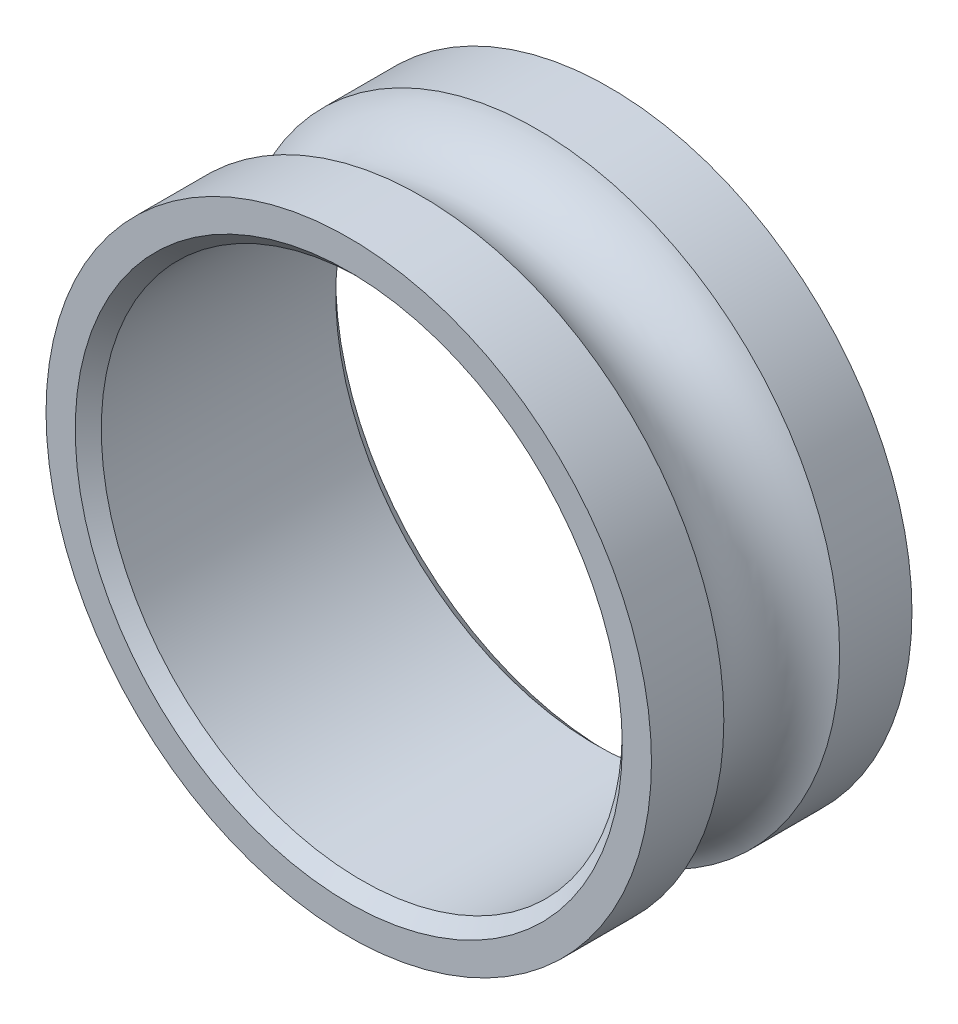
ISO-10303-21;
HEADER;
FILE_DESCRIPTION(('STEP AP214'),'2;1');
FILE_NAME('part.step','',(''),(''),'','','');
FILE_SCHEMA(('AUTOMOTIVE_DESIGN { 1 0 10303 214 1 1 1 1 }'));
ENDSEC;
DATA;
#1=APPLICATION_CONTEXT('core data for automotive mechanical design processes');
#2=APPLICATION_PROTOCOL_DEFINITION('international standard','automotive_design',2000,#1);
#3=PRODUCT_CONTEXT('',#1,'mechanical');
#4=PRODUCT('Part','Part','',(#3));
#5=PRODUCT_RELATED_PRODUCT_CATEGORY('part','',(#4));
#6=PRODUCT_DEFINITION_FORMATION('','',#4);
#7=PRODUCT_DEFINITION_CONTEXT('part definition',#1,'design');
#8=PRODUCT_DEFINITION('design','',#6,#7);
#9=PRODUCT_DEFINITION_SHAPE('','',#8);
#10=(LENGTH_UNIT() NAMED_UNIT(*) SI_UNIT(.MILLI.,.METRE.));
#11=(NAMED_UNIT(*) PLANE_ANGLE_UNIT() SI_UNIT($,.RADIAN.));
#12=(NAMED_UNIT(*) SI_UNIT($,.STERADIAN.) SOLID_ANGLE_UNIT());
#13=UNCERTAINTY_MEASURE_WITH_UNIT(LENGTH_MEASURE(1.E-05),#10,'distance_accuracy_value','');
#14=(GEOMETRIC_REPRESENTATION_CONTEXT(3) GLOBAL_UNCERTAINTY_ASSIGNED_CONTEXT((#13)) GLOBAL_UNIT_ASSIGNED_CONTEXT((#10,
#11,#12)) REPRESENTATION_CONTEXT('',''));
#15=CARTESIAN_POINT('',(0.,0.,0.));
#16=DIRECTION('',(0.,0.,1.));
#17=DIRECTION('',(1.,0.,0.));
#18=AXIS2_PLACEMENT_3D('',#15,#16,#17);
#19=CARTESIAN_POINT('',(3.33375000002434,0.,1.5875));
#20=DIRECTION('',(0.,0.,1.));
#21=DIRECTION('',(1.,0.,0.));
#22=AXIS2_PLACEMENT_3D('',#19,#20,#21);
#23=PLANE('',#22);
#24=CARTESIAN_POINT('',(0.,0.,1.5875));
#25=DIRECTION('',(0.,0.,1.));
#26=DIRECTION('',(1.,0.,0.));
#27=AXIS2_PLACEMENT_3D('',#24,#25,#26);
#28=CIRCLE('',#27,3.68962912087912);
#29=CARTESIAN_POINT('',(3.68962912087912,0.,1.5875));
#30=VERTEX_POINT('',#29);
#31=EDGE_CURVE('E64',#30,#30,#28,.T.);
#32=ORIENTED_EDGE('',*,*,#31,.T.);
#33=EDGE_LOOP('',(#32));
#34=FACE_BOUND('',#33,.T.);
#35=CARTESIAN_POINT('',(0.,0.,1.5875));
#36=DIRECTION('',(0.,0.,1.));
#37=DIRECTION('',(1.,0.,0.));
#38=AXIS2_PLACEMENT_3D('',#35,#36,#37);
#39=CIRCLE('',#38,3.33375000002434);
#40=CARTESIAN_POINT('',(3.33375000002434,0.,1.5875));
#41=VERTEX_POINT('',#40);
#42=EDGE_CURVE('E10',#41,#41,#39,.T.);
#43=ORIENTED_EDGE('',*,*,#42,.F.);
#44=EDGE_LOOP('',(#43));
#45=FACE_BOUND('',#44,.T.);
#46=ADVANCED_FACE('F36',(#34,#45),#23,.T.);
#47=CARTESIAN_POINT('',(0.,0.,1.42874999997392));
#48=DIRECTION('',(0.,0.,1.));
#49=DIRECTION('',(1.,0.,0.));
#50=AXIS2_PLACEMENT_3D('',#47,#48,#49);
#51=CONICAL_SURFACE('',#50,3.17499999999825,0.785398163397447);
#52=ORIENTED_EDGE('',*,*,#42,.T.);
#53=EDGE_LOOP('',(#52));
#54=FACE_BOUND('',#53,.T.);
#55=CARTESIAN_POINT('',(0.,0.,1.42874999997392));
#56=DIRECTION('',(0.,0.,1.));
#57=DIRECTION('',(1.,0.,0.));
#58=AXIS2_PLACEMENT_3D('',#55,#56,#57);
#59=CIRCLE('',#58,3.17499999999825);
#60=CARTESIAN_POINT('',(3.17499999999825,0.,1.42874999997392));
#61=VERTEX_POINT('',#60);
#62=EDGE_CURVE('E42',#61,#61,#59,.T.);
#63=ORIENTED_EDGE('',*,*,#62,.F.);
#64=EDGE_LOOP('',(#63));
#65=FACE_BOUND('',#64,.T.);
#66=ADVANCED_FACE('F82',(#54,#65),#51,.F.);
#67=CARTESIAN_POINT('',(0.,0.,-1.5875));
#68=DIRECTION('',(0.,0.,1.));
#69=DIRECTION('',(1.,0.,0.));
#70=AXIS2_PLACEMENT_3D('',#67,#68,#69);
#71=CYLINDRICAL_SURFACE('',#70,3.17499999999825);
#72=ORIENTED_EDGE('',*,*,#62,.T.);
#73=EDGE_LOOP('',(#72));
#74=FACE_BOUND('',#73,.T.);
#75=CARTESIAN_POINT('',(0.,0.,-1.42875000002608));
#76=DIRECTION('',(0.,0.,1.));
#77=DIRECTION('',(1.,0.,0.));
#78=AXIS2_PLACEMENT_3D('',#75,#76,#77);
#79=CIRCLE('',#78,3.17499999999825);
#80=CARTESIAN_POINT('',(3.17499999999825,0.,-1.42875000002608));
#81=VERTEX_POINT('',#80);
#82=EDGE_CURVE('E46',#81,#81,#79,.T.);
#83=ORIENTED_EDGE('',*,*,#82,.F.);
#84=EDGE_LOOP('',(#83));
#85=FACE_BOUND('',#84,.T.);
#86=ADVANCED_FACE('F86',(#74,#85),#71,.F.);
#87=CARTESIAN_POINT('',(0.,0.,-1.58750000002375));
#88=DIRECTION('',(0.,0.,-1.));
#89=DIRECTION('',(-1.,0.,0.));
#90=AXIS2_PLACEMENT_3D('',#87,#88,#89);
#91=CONICAL_SURFACE('',#90,3.33374999999592,0.785398163397449);
#92=ORIENTED_EDGE('',*,*,#82,.T.);
#93=EDGE_LOOP('',(#92));
#94=FACE_BOUND('',#93,.T.);
#95=CARTESIAN_POINT('',(0.,0.,-1.58750000002375));
#96=DIRECTION('',(0.,0.,1.));
#97=DIRECTION('',(1.,0.,0.));
#98=AXIS2_PLACEMENT_3D('',#95,#96,#97);
#99=CIRCLE('',#98,3.33374999999592);
#100=CARTESIAN_POINT('',(3.33374999999592,0.,-1.58750000002375));
#101=VERTEX_POINT('',#100);
#102=EDGE_CURVE('E50',#101,#101,#99,.T.);
#103=ORIENTED_EDGE('',*,*,#102,.F.);
#104=EDGE_LOOP('',(#103));
#105=FACE_BOUND('',#104,.T.);
#106=ADVANCED_FACE('F90',(#94,#105),#91,.F.);
#107=CARTESIAN_POINT('',(3.68962912087912,0.,-1.58750000002375));
#108=DIRECTION('',(0.,0.,-1.));
#109=DIRECTION('',(-1.,0.,0.));
#110=AXIS2_PLACEMENT_3D('',#107,#108,#109);
#111=PLANE('',#110);
#112=ORIENTED_EDGE('',*,*,#102,.T.);
#113=EDGE_LOOP('',(#112));
#114=FACE_BOUND('',#113,.T.);
#115=CARTESIAN_POINT('',(0.,0.,-1.58750000002375));
#116=DIRECTION('',(0.,0.,1.));
#117=DIRECTION('',(1.,0.,0.));
#118=AXIS2_PLACEMENT_3D('',#115,#116,#117);
#119=CIRCLE('',#118,3.68962912087912);
#120=CARTESIAN_POINT('',(3.68962912087912,0.,-1.58750000002375));
#121=VERTEX_POINT('',#120);
#122=EDGE_CURVE('E55',#121,#121,#119,.T.);
#123=ORIENTED_EDGE('',*,*,#122,.F.);
#124=EDGE_LOOP('',(#123));
#125=FACE_BOUND('',#124,.T.);
#126=ADVANCED_FACE('F96',(#114,#125),#111,.T.);
#127=CARTESIAN_POINT('',(0.,0.,-1.5875));
#128=DIRECTION('',(0.,0.,1.));
#129=DIRECTION('',(1.,0.,0.));
#130=AXIS2_PLACEMENT_3D('',#127,#128,#129);
#131=CYLINDRICAL_SURFACE('',#130,3.68962912087912);
#132=ORIENTED_EDGE('',*,*,#122,.T.);
#133=EDGE_LOOP('',(#132));
#134=FACE_BOUND('',#133,.T.);
#135=CARTESIAN_POINT('',(0.,0.,-0.705555555555557));
#136=DIRECTION('',(0.,0.,1.));
#137=DIRECTION('',(1.,0.,0.));
#138=AXIS2_PLACEMENT_3D('',#135,#136,#137);
#139=CIRCLE('',#138,3.68962912087912);
#140=CARTESIAN_POINT('',(3.68962912087912,0.,-0.705555555555557));
#141=VERTEX_POINT('',#140);
#142=EDGE_CURVE('E58',#141,#141,#139,.T.);
#143=ORIENTED_EDGE('',*,*,#142,.F.);
#144=EDGE_LOOP('',(#143));
#145=FACE_BOUND('',#144,.T.);
#146=ADVANCED_FACE('F78',(#134,#145),#131,.T.);
#147=CARTESIAN_POINT('',(0.,0.,0.));
#148=DIRECTION('',(0.,0.,1.));
#149=DIRECTION('',(1.,0.,0.));
#150=AXIS2_PLACEMENT_3D('',#147,#148,#149);
#151=TOROIDAL_SURFACE('',#150,3.96875,0.758760243513404);
#152=ORIENTED_EDGE('',*,*,#142,.T.);
#153=EDGE_LOOP('',(#152));
#154=FACE_BOUND('',#153,.T.);
#155=CARTESIAN_POINT('',(0.,0.,0.705555555555556));
#156=DIRECTION('',(0.,0.,1.));
#157=DIRECTION('',(1.,0.,0.));
#158=AXIS2_PLACEMENT_3D('',#155,#156,#157);
#159=CIRCLE('',#158,3.68962912087912);
#160=CARTESIAN_POINT('',(3.68962912087912,0.,0.705555555555556));
#161=VERTEX_POINT('',#160);
#162=EDGE_CURVE('E61',#161,#161,#159,.T.);
#163=ORIENTED_EDGE('',*,*,#162,.F.);
#164=EDGE_LOOP('',(#163));
#165=FACE_BOUND('',#164,.T.);
#166=ADVANCED_FACE('F72',(#154,#165),#151,.F.);
#167=CARTESIAN_POINT('',(0.,0.,-1.5875));
#168=DIRECTION('',(0.,0.,1.));
#169=DIRECTION('',(1.,0.,0.));
#170=AXIS2_PLACEMENT_3D('',#167,#168,#169);
#171=CYLINDRICAL_SURFACE('',#170,3.68962912087912);
#172=ORIENTED_EDGE('',*,*,#162,.T.);
#173=EDGE_LOOP('',(#172));
#174=FACE_BOUND('',#173,.T.);
#175=ORIENTED_EDGE('',*,*,#31,.F.);
#176=EDGE_LOOP('',(#175));
#177=FACE_BOUND('',#176,.T.);
#178=ADVANCED_FACE('F70',(#174,#177),#171,.T.);
#179=CLOSED_SHELL('',(#46,#66,#86,#106,#126,#146,#166,#178));
#180=MANIFOLD_SOLID_BREP('B2',#179);
#181=ADVANCED_BREP_SHAPE_REPRESENTATION('',(#18,#180),#14);
#182=SHAPE_DEFINITION_REPRESENTATION(#9,#181);
ENDSEC;
END-ISO-10303-21;
